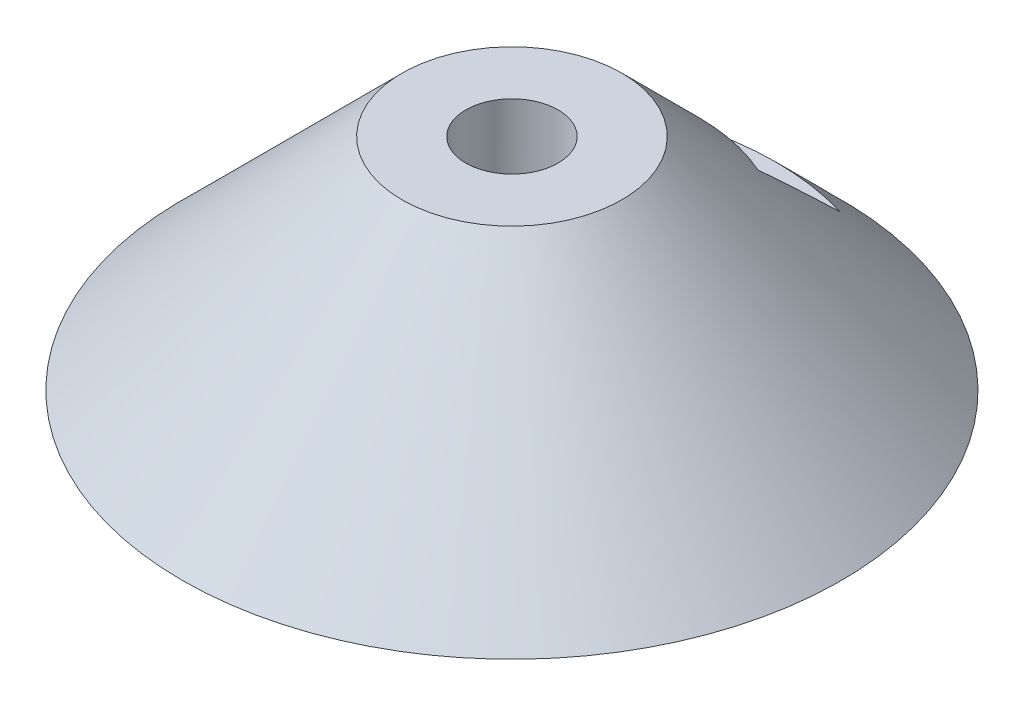
ISO-10303-21;
HEADER;
FILE_DESCRIPTION(('STEP AP214'),'2;1');
FILE_NAME('part.step','',(''),(''),'','','');
FILE_SCHEMA(('AUTOMOTIVE_DESIGN { 1 0 10303 214 1 1 1 1 }'));
ENDSEC;
DATA;
#1=APPLICATION_CONTEXT('core data for automotive mechanical design processes');
#2=APPLICATION_PROTOCOL_DEFINITION('international standard','automotive_design',2000,#1);
#3=PRODUCT_CONTEXT('',#1,'mechanical');
#4=PRODUCT('Part','Part','',(#3));
#5=PRODUCT_RELATED_PRODUCT_CATEGORY('part','',(#4));
#6=PRODUCT_DEFINITION_FORMATION('','',#4);
#7=PRODUCT_DEFINITION_CONTEXT('part definition',#1,'design');
#8=PRODUCT_DEFINITION('design','',#6,#7);
#9=PRODUCT_DEFINITION_SHAPE('','',#8);
#10=(LENGTH_UNIT() NAMED_UNIT(*) SI_UNIT(.MILLI.,.METRE.));
#11=(NAMED_UNIT(*) PLANE_ANGLE_UNIT() SI_UNIT($,.RADIAN.));
#12=(NAMED_UNIT(*) SI_UNIT($,.STERADIAN.) SOLID_ANGLE_UNIT());
#13=UNCERTAINTY_MEASURE_WITH_UNIT(LENGTH_MEASURE(1.E-05),#10,'distance_accuracy_value','');
#14=(GEOMETRIC_REPRESENTATION_CONTEXT(3) GLOBAL_UNCERTAINTY_ASSIGNED_CONTEXT((#13)) GLOBAL_UNIT_ASSIGNED_CONTEXT((#10,
#11,#12)) REPRESENTATION_CONTEXT('',''));
#15=CARTESIAN_POINT('',(0.,0.,0.));
#16=DIRECTION('',(0.,0.,1.));
#17=DIRECTION('',(1.,0.,0.));
#18=AXIS2_PLACEMENT_3D('',#15,#16,#17);
#19=CARTESIAN_POINT('',(0.,10.,0.));
#20=DIRECTION('',(0.,1.,0.));
#21=DIRECTION('',(0.,0.,1.));
#22=AXIS2_PLACEMENT_3D('',#19,#20,#21);
#23=CYLINDRICAL_SURFACE('',#22,4.2);
#24=CARTESIAN_POINT('',(0.,20.,0.));
#25=DIRECTION('',(0.,1.,0.));
#26=DIRECTION('',(0.,0.,1.));
#27=AXIS2_PLACEMENT_3D('',#24,#25,#26);
#28=CIRCLE('',#27,4.2);
#29=CARTESIAN_POINT('',(0.,20.,4.2));
#30=VERTEX_POINT('',#29);
#31=EDGE_CURVE('E213',#30,#30,#28,.T.);
#32=ORIENTED_EDGE('',*,*,#31,.T.);
#33=EDGE_LOOP('',(#32));
#34=FACE_BOUND('',#33,.T.);
#35=CARTESIAN_POINT('',(0.,13.,0.));
#36=DIRECTION('',(0.,1.,0.));
#37=DIRECTION('',(-1.,0.,0.));
#38=AXIS2_PLACEMENT_3D('',#35,#36,#37);
#39=CIRCLE('',#38,4.2);
#40=CARTESIAN_POINT('',(-4.2,13.,0.));
#41=VERTEX_POINT('',#40);
#42=EDGE_CURVE('E180',#41,#41,#39,.F.);
#43=ORIENTED_EDGE('',*,*,#42,.T.);
#44=EDGE_LOOP('',(#43));
#45=FACE_BOUND('',#44,.T.);
#46=ADVANCED_FACE('F33',(#34,#45),#23,.F.);
#47=CARTESIAN_POINT('',(0.,20.,0.));
#48=DIRECTION('',(0.,1.,0.));
#49=DIRECTION('',(0.,0.,1.));
#50=AXIS2_PLACEMENT_3D('',#47,#48,#49);
#51=PLANE('',#50);
#52=ORIENTED_EDGE('',*,*,#31,.F.);
#53=EDGE_LOOP('',(#52));
#54=FACE_BOUND('',#53,.T.);
#55=CARTESIAN_POINT('',(0.,20.,0.));
#56=DIRECTION('',(0.,-1.,0.));
#57=DIRECTION('',(0.,0.,-1.));
#58=AXIS2_PLACEMENT_3D('',#55,#56,#57);
#59=CIRCLE('',#58,10.);
#60=CARTESIAN_POINT('',(0.,20.,-10.));
#61=VERTEX_POINT('',#60);
#62=EDGE_CURVE('E212',#61,#61,#59,.T.);
#63=ORIENTED_EDGE('',*,*,#62,.F.);
#64=EDGE_LOOP('',(#63));
#65=FACE_BOUND('',#64,.T.);
#66=ADVANCED_FACE('F35',(#54,#65),#51,.T.);
#67=CARTESIAN_POINT('',(0.,0.,0.));
#68=DIRECTION('',(0.,-1.,0.));
#69=DIRECTION('',(0.,0.,-1.));
#70=AXIS2_PLACEMENT_3D('',#67,#68,#69);
#71=CONICAL_SURFACE('',#70,30.,0.785398163397448);
#72=CARTESIAN_POINT('',(0.999999999999996,25.2150380177234,-4.67930135509917));
#73=CARTESIAN_POINT('',(0.999999999999996,25.0517172309487,-4.84629975117157));
#74=CARTESIAN_POINT('',(0.999999999999996,24.8882122976122,-5.01311773842072));
#75=CARTESIAN_POINT('',(0.999999999999996,24.5609109565375,-5.34646720047292));
#76=CARTESIAN_POINT('',(0.999999999999996,24.397114549129,-5.51299867559966));
#77=CARTESIAN_POINT('',(0.999999999999996,23.9054038124882,-6.01227431670805));
#78=CARTESIAN_POINT('',(0.999999999999997,23.5771669479885,-6.34470074034811));
#79=CARTESIAN_POINT('',(0.999999999999997,22.9201644927157,-7.00902751143231));
#80=CARTESIAN_POINT('',(0.999999999999997,22.5913989042116,-7.34092786112209));
#81=CARTESIAN_POINT('',(0.999999999999997,21.9335123037873,-8.00437673410787));
#82=CARTESIAN_POINT('',(0.999999999999997,21.6043912915011,-8.33592525704109));
#83=CARTESIAN_POINT('',(0.999999999999997,20.616673858789,-9.33020191409151));
#84=CARTESIAN_POINT('',(0.999999999999997,19.9577146617943,-9.99256959749343));
#85=CARTESIAN_POINT('',(0.999999999999997,18.6392775168894,-11.3167885298493));
#86=CARTESIAN_POINT('',(0.999999999999997,17.9797995688589,-11.9786397786836));
#87=CARTESIAN_POINT('',(0.999999999999998,16.000904746931,-13.963733940631));
#88=CARTESIAN_POINT('',(0.999999999999998,14.6810268924155,-15.2865172719845));
#89=CARTESIAN_POINT('',(0.999999999999998,12.0407384748654,-17.9315636519172));
#90=CARTESIAN_POINT('',(0.999999999999999,10.7203279094961,-19.253826698165));
#91=CARTESIAN_POINT('',(0.999999999999999,8.07921381784963,-21.8980597941546));
#92=CARTESIAN_POINT('',(0.999999999999999,6.75851029161687,-23.2200298439407));
#93=CARTESIAN_POINT('',(1.,4.92586477296996,-25.0541947235452));
#94=CARTESIAN_POINT('',(1.,4.41399568473043,-25.5664624082262));
#95=CARTESIAN_POINT('',(1.,3.39023574502775,-26.5909748048737));
#96=CARTESIAN_POINT('',(1.,2.8783448935914,-27.1032195168669));
#97=CARTESIAN_POINT('',(1.,0.459376789247896,-29.5237740456985));
#98=CARTESIAN_POINT('',(1.,-1.44781733304404,-31.4319670685749));
#99=CARTESIAN_POINT('',(1.,-5.26234784190351,-35.248210928104));
#100=CARTESIAN_POINT('',(1.,-7.16968422847181,-37.156261764756));
#101=CARTESIAN_POINT('',(1.,-10.984456855789,-40.9722846745505));
#102=CARTESIAN_POINT('',(1.,-12.8918930970311,-42.8802567472002));
#103=CARTESIAN_POINT('',(1.,-16.7068273161898,-46.6961391374665));
#104=CARTESIAN_POINT('',(1.,-18.6143252941059,-48.6040494550837));
#105=CARTESIAN_POINT('',(1.,-20.5218403627525,-50.5119426832848));
#106=B_SPLINE_CURVE_WITH_KNOTS('',3,(#72,#73,#74,#75,#76,#77,#78,#79,#80,#81,#82,#83,#84,#85,
#86,#87,#88,#89,#90,#91,#92,#93,#94,#95,#96,#97,#98,#99,#100,#101,#102,#103,#104,#105),
.UNSPECIFIED.,.F.,.F.,(4,2,2,2,2,2,2,2,2,2,2,2,2,2,2,2,4),(0.,0.700755756576796,
1.40151072093304,2.80301627361192,4.20451582753784,5.60601682521214,8.40898309345436,
11.2119500112723,16.8178838350772,22.4238425003767,28.0298003162505,30.2023226526668,
32.3748423866764,40.468501017208,48.562159691145,56.6558630443662,64.7495663254621),.UNSPECIFIED.);
#107=CARTESIAN_POINT('',(1.,2.,-27.9821371592665));
#108=VERTEX_POINT('',#107);
#109=CARTESIAN_POINT('',(1.,0.,-29.9833287011299));
#110=VERTEX_POINT('',#109);
#111=EDGE_CURVE('E133',#108,#110,#106,.T.);
#112=ORIENTED_EDGE('',*,*,#111,.F.);
#113=CARTESIAN_POINT('',(0.,2.,0.));
#114=DIRECTION('',(0.,1.,0.));
#115=DIRECTION('',(-1.,0.,0.));
#116=AXIS2_PLACEMENT_3D('',#113,#114,#115);
#117=CIRCLE('',#116,28.);
#118=CARTESIAN_POINT('',(-1.,2.,-27.9821371592665));
#119=VERTEX_POINT('',#118);
#120=EDGE_CURVE('E11',#119,#108,#117,.F.);
#121=ORIENTED_EDGE('',*,*,#120,.F.);
#122=CARTESIAN_POINT('',(-0.999999999999998,-20.5218403627525,-50.5119426832848));
#123=CARTESIAN_POINT('',(-0.999999999999999,-18.6143295707202,-48.6040537130351));
#124=CARTESIAN_POINT('',(-0.999999999999999,-16.7068358547122,-46.6961476680991));
#125=CARTESIAN_POINT('',(-0.999999999999999,-12.8919106980718,-42.8802743626458));
#126=CARTESIAN_POINT('',(-0.999999999999999,-10.9844792574225,-40.9723071021454));
#127=CARTESIAN_POINT('',(-0.999999999999999,-7.16970717705744,-37.1562847019134));
#128=CARTESIAN_POINT('',(-1.,-5.26236653727402,-35.2482295622495));
#129=CARTESIAN_POINT('',(-1.,-1.44782688723327,-31.4319766966962));
#130=CARTESIAN_POINT('',(-1.,0.459372122986266,-29.5237789707689));
#131=CARTESIAN_POINT('',(-1.,3.31998287424995,-26.6612917702415));
#132=CARTESIAN_POINT('',(-1.,4.27348923922513,-25.7070968588784));
#133=CARTESIAN_POINT('',(-1.,6.18041282983299,-23.798618166586));
#134=CARTESIAN_POINT('',(-1.,7.13383005547493,-22.844334385666));
#135=CARTESIAN_POINT('',(-1.,9.04053619540605,-20.9356401862702));
#136=CARTESIAN_POINT('',(-1.,9.99382510979869,-19.9812297678978));
#137=CARTESIAN_POINT('',(-1.,11.9002090801547,-18.0722146270131));
#138=CARTESIAN_POINT('',(-1.,12.8533041360458,-17.1176099044287));
#139=CARTESIAN_POINT('',(-1.,14.7591866821059,-15.2080880927494));
#140=CARTESIAN_POINT('',(-1.,15.7119741714082,-14.2531710027894));
#141=CARTESIAN_POINT('',(-1.,17.1407325072099,-12.8203748446561));
#142=CARTESIAN_POINT('',(-1.,17.6169145018919,-12.3427063401789));
#143=CARTESIAN_POINT('',(-1.,18.5690776009843,-11.3871687569283));
#144=CARTESIAN_POINT('',(-1.,19.0450587053174,-10.9092996780777));
#145=CARTESIAN_POINT('',(-1.,19.9967288157696,-9.95326656654492));
#146=CARTESIAN_POINT('',(-1.,20.4724178206012,-9.47510253258097));
#147=CARTESIAN_POINT('',(-1.,21.423343479333,-8.51832568190032));
#148=CARTESIAN_POINT('',(-1.,21.8985801337164,-8.03971286566408));
#149=CARTESIAN_POINT('',(-1.,22.6108628548803,-7.32122381438795));
#150=CARTESIAN_POINT('',(-1.,22.8481956552577,-7.08163188221354));
#151=CARTESIAN_POINT('',(-1.,23.322598503967,-6.60218827834783));
#152=CARTESIAN_POINT('',(-1.,23.5596685524492,-6.36233660680526));
#153=CARTESIAN_POINT('',(-1.,24.033452834247,-5.88228004479473));
#154=CARTESIAN_POINT('',(-1.,24.2701670662081,-5.64207515298891));
#155=CARTESIAN_POINT('',(-1.,24.743054565741,-5.16113265344163));
#156=CARTESIAN_POINT('',(-1.,24.9792278322283,-4.92039504463392));
#157=CARTESIAN_POINT('',(-1.,25.2150380177234,-4.67930135509916));
#158=B_SPLINE_CURVE_WITH_KNOTS('',3,(#122,#123,#124,#125,#126,#127,#128,#129,#130,#131,#132,
#133,#134,#135,#136,#137,#138,#139,#140,#141,#142,#143,#144,#145,#146,#147,#148,#149,#150,#151,
#152,#153,#154,#155,#156,#157),.UNSPECIFIED.,.F.,.F.,(4,2,2,2,2,2,2,2,2,2,2,2,2,2,2,2,2,4),(0.,
8.09368517651437,16.1873681380471,24.281044962399,32.3747239387857,36.4215697250926,
40.4684150902235,44.5152571726089,48.5621007616448,52.6089556554918,54.6323805441287,
56.6558062120812,58.6792407364762,60.7026730970467,61.7143944279245,62.7261151797259,
63.7378397734158,64.7495663939689),.UNSPECIFIED.);
#159=CARTESIAN_POINT('',(-1.,0.,-29.9833287011299));
#160=VERTEX_POINT('',#159);
#161=EDGE_CURVE('E110',#160,#119,#158,.T.);
#162=ORIENTED_EDGE('',*,*,#161,.F.);
#163=CARTESIAN_POINT('',(0.,0.,0.));
#164=DIRECTION('',(0.,-1.,0.));
#165=DIRECTION('',(0.,0.,-1.));
#166=AXIS2_PLACEMENT_3D('',#163,#164,#165);
#167=CIRCLE('',#166,30.);
#168=EDGE_CURVE('E207',#110,#160,#167,.T.);
#169=ORIENTED_EDGE('',*,*,#168,.F.);
#170=EDGE_LOOP('',(#112,#121,#162,#169));
#171=FACE_BOUND('',#170,.T.);
#172=CARTESIAN_POINT('',(6.85000000000001,10.287823726375,18.4837061608992));
#173=CARTESIAN_POINT('',(6.85000000000001,10.5592129197154,18.1942719031834));
#174=CARTESIAN_POINT('',(6.85000000000001,10.8302005525982,17.9044604565862));
#175=CARTESIAN_POINT('',(6.85000000000001,11.3712353256481,17.3239577546807));
#176=CARTESIAN_POINT('',(6.85000000000001,11.6412824599144,17.0332664938735));
#177=CARTESIAN_POINT('',(6.85000000000001,12.1803708837145,16.4508008634571));
#178=CARTESIAN_POINT('',(6.85,12.4494118706081,16.1590262135012));
#179=CARTESIAN_POINT('',(6.85,12.9862274642277,15.5743163175319));
#180=CARTESIAN_POINT('',(6.85,13.2540020730851,15.2813810734732));
#181=CARTESIAN_POINT('',(6.85,14.0598435230963,14.395387291069));
#182=CARTESIAN_POINT('',(6.85,14.5956633680994,13.8002747669187));
#183=CARTESIAN_POINT('',(6.85,15.3929709232838,12.9020004647038));
#184=CARTESIAN_POINT('',(6.85,15.6576470196606,12.6016677853495));
#185=CARTESIAN_POINT('',(6.85,16.1844073256703,11.9987367538236));
#186=CARTESIAN_POINT('',(6.85,16.4464915470152,11.6961384119008));
#187=CARTESIAN_POINT('',(6.85,16.9246274368195,11.1382211651575));
#188=CARTESIAN_POINT('',(6.85,17.1411589570244,10.883313750226));
#189=CARTESIAN_POINT('',(6.85,17.5715550462699,10.3712583009672));
#190=CARTESIAN_POINT('',(6.85,17.7854196399821,10.1141102874051));
#191=CARTESIAN_POINT('',(6.85,18.210020828636,9.59702560948227));
#192=CARTESIAN_POINT('',(6.85,18.4207558097211,9.33708761781746));
#193=CARTESIAN_POINT('',(6.85,18.8382423341417,8.81403260714637));
#194=CARTESIAN_POINT('',(6.85,19.0449939441638,8.55091564148029));
#195=CARTESIAN_POINT('',(6.85,19.4531065155555,8.02140115178565));
#196=CARTESIAN_POINT('',(6.85,19.6544778552407,7.75501164793901));
#197=CARTESIAN_POINT('',(6.85,20.0509811911141,7.21757638902787));
#198=CARTESIAN_POINT('',(6.85,20.2461126583663,6.9465302422111));
#199=CARTESIAN_POINT('',(6.85,20.6281566927384,6.39901481390294));
#200=CARTESIAN_POINT('',(6.85,20.8150759194353,6.12255019974796));
#201=CARTESIAN_POINT('',(6.85,21.1783376620013,5.56278909555116));
#202=CARTESIAN_POINT('',(6.85,21.3546826228225,5.27949420619174));
#203=CARTESIAN_POINT('',(6.85,21.658551646515,4.76353878449574));
#204=CARTESIAN_POINT('',(6.85,21.7886697620585,4.53241297638214));
#205=CARTESIAN_POINT('',(6.85,22.0376069428567,4.06405869774873));
#206=CARTESIAN_POINT('',(6.85,22.1564244244078,3.82682937776645));
#207=CARTESIAN_POINT('',(6.85,22.3794140060114,3.346056600015));
#208=CARTESIAN_POINT('',(6.85,22.4836130439851,3.10252576229004));
#209=CARTESIAN_POINT('',(6.85,22.6737264360081,2.60839109659098));
#210=CARTESIAN_POINT('',(6.85,22.7596467632156,2.35778960959304));
#211=CARTESIAN_POINT('',(6.85,22.8921885978546,1.90633409416419));
#212=CARTESIAN_POINT('',(6.85,22.9433002815181,1.70680515788605));
#213=CARTESIAN_POINT('',(6.85,23.0296932361975,1.30432600264772));
#214=CARTESIAN_POINT('',(6.85,23.0649767959726,1.10137628274203));
#215=CARTESIAN_POINT('',(6.85,23.117940138469,0.693556778125896));
#216=CARTESIAN_POINT('',(6.85,23.1356536623992,0.488691439227577));
#217=CARTESIAN_POINT('',(6.85,23.1526231944426,0.0781873442567327));
#218=CARTESIAN_POINT('',(6.85,23.1518794462469,-0.127451401568664));
#219=CARTESIAN_POINT('',(6.85,23.1319793238094,-0.537778059702156));
#220=CARTESIAN_POINT('',(6.85,23.1128268043136,-0.742466162056044));
#221=CARTESIAN_POINT('',(6.85,23.0571575394933,-1.14944637703354));
#222=CARTESIAN_POINT('',(6.85,23.0206394522803,-1.35173830325925));
#223=CARTESIAN_POINT('',(6.85,22.9319061310297,-1.75325378913386));
#224=CARTESIAN_POINT('',(6.85,22.8796577795835,-1.95246993375936));
#225=CARTESIAN_POINT('',(6.85,22.7615944363081,-2.34679022793257));
#226=CARTESIAN_POINT('',(6.85,22.6957793738723,-2.54189435607388));
#227=CARTESIAN_POINT('',(6.85,22.5349556910257,-2.97563885710656));
#228=CARTESIAN_POINT('',(6.85,22.4367541654266,-3.21308880284094));
#229=CARTESIAN_POINT('',(6.85,22.2261225464774,-3.68164475170689));
#230=CARTESIAN_POINT('',(6.85,22.1136853942494,-3.91274753787471));
#231=CARTESIAN_POINT('',(6.85,21.877374071441,-4.36953337678908));
#232=CARTESIAN_POINT('',(6.85,21.753478891349,-4.59520547766643));
#233=CARTESIAN_POINT('',(6.85,21.4967964687286,-5.0413538418556));
#234=CARTESIAN_POINT('',(6.85,21.3640106018125,-5.26183090186651));
#235=CARTESIAN_POINT('',(6.85,21.090159114958,-5.70020186281882));
#236=CARTESIAN_POINT('',(6.85,20.949032094955,-5.91805722612368));
#237=CARTESIAN_POINT('',(6.85,20.6609616742015,-6.34988185000282));
#238=CARTESIAN_POINT('',(6.85,20.5140181064291,-6.56385099872684));
#239=CARTESIAN_POINT('',(6.85,20.2155783621992,-6.98821350480857));
#240=CARTESIAN_POINT('',(6.85,20.0640876092851,-7.1986106873859));
#241=CARTESIAN_POINT('',(6.85,19.7572380589436,-7.61654701717048));
#242=CARTESIAN_POINT('',(6.85,19.6018793974001,-7.82408626438348));
#243=CARTESIAN_POINT('',(6.85,19.2697352417113,-8.26065534203935));
#244=CARTESIAN_POINT('',(6.85,19.0925552058009,-8.48938458460586));
#245=CARTESIAN_POINT('',(6.85,18.7348993275159,-8.94425452117135));
#246=CARTESIAN_POINT('',(6.85,18.5544234049373,-9.17039515195911));
#247=CARTESIAN_POINT('',(6.85,18.0088790580272,-9.84556364502567));
#248=CARTESIAN_POINT('',(6.85,17.6397286423078,-10.2912931193322));
#249=CARTESIAN_POINT('',(6.85,16.8935866537654,-11.1764042331247));
#250=CARTESIAN_POINT('',(6.85,16.5165920418563,-11.6157832961806));
#251=CARTESIAN_POINT('',(6.85,15.7569010539616,-12.4895933886598));
#252=CARTESIAN_POINT('',(6.85,15.3742045490748,-12.9240243058288));
#253=CARTESIAN_POINT('',(6.85,14.6039224505418,-13.78969610836));
#254=CARTESIAN_POINT('',(6.85,14.216330358095,-14.2209311996504));
#255=CARTESIAN_POINT('',(6.85,13.4377888297256,-15.0803657940975));
#256=CARTESIAN_POINT('',(6.85,13.0468393542324,-15.508565261367));
#257=CARTESIAN_POINT('',(6.85,12.2623874177801,-16.36242071819));
#258=CARTESIAN_POINT('',(6.85000000000001,11.868885615768,-16.7880773136848));
#259=CARTESIAN_POINT('',(6.85000000000001,11.0797461127261,-17.637405846188));
#260=CARTESIAN_POINT('',(6.85000000000001,10.6841084079162,-18.0610777796817));
#261=CARTESIAN_POINT('',(6.85000000000001,9.49831052264474,-19.3257035906861));
#262=CARTESIAN_POINT('',(6.85000000000001,8.70558789421593,-20.1642543650887));
#263=CARTESIAN_POINT('',(6.85000000000001,7.11537222020745,-21.8369071091126));
#264=CARTESIAN_POINT('',(6.85000000000001,6.317878891331,-22.6710088088591));
#265=CARTESIAN_POINT('',(6.85000000000001,4.72006618062262,-24.3352973941143));
#266=CARTESIAN_POINT('',(6.85000000000001,3.91974936709643,-25.165486746668));
#267=CARTESIAN_POINT('',(6.85000000000001,2.31657746211807,-26.8233827622911));
#268=CARTESIAN_POINT('',(6.85000000000001,1.51372241282614,-27.6510894661571));
#269=CARTESIAN_POINT('',(6.85000000000001,-0.383419654946413,-29.6023489586463));
#270=CARTESIAN_POINT('',(6.85000000000001,-1.47853477422168,-30.7250963969376));
#271=CARTESIAN_POINT('',(6.85000000000001,-3.67158539833946,-32.9682954005424));
#272=CARTESIAN_POINT('',(6.85000000000001,-4.76952144980312,-34.0887464311174));
#273=CARTESIAN_POINT('',(6.85000000000002,-6.96944114862572,-36.329921233503));
#274=CARTESIAN_POINT('',(6.85000000000002,-8.07142851779619,-37.4506413508342));
#275=CARTESIAN_POINT('',(6.85000000000002,-10.276667449624,-39.6903603436475));
#276=CARTESIAN_POINT('',(6.85000000000002,-11.3799186875978,-40.8093595387742));
#277=CARTESIAN_POINT('',(6.85000000000002,-12.4837061608992,-41.9278283382961));
#278=B_SPLINE_CURVE_WITH_KNOTS('',3,(#172,#173,#174,#175,#176,#177,#178,#179,#180,#181,#182,
#183,#184,#185,#186,#187,#188,#189,#190,#191,#192,#193,#194,#195,#196,#197,#198,#199,#200,#201,
#202,#203,#204,#205,#206,#207,#208,#209,#210,#211,#212,#213,#214,#215,#216,#217,#218,#219,#220,
#221,#222,#223,#224,#225,#226,#227,#228,#229,#230,#231,#232,#233,#234,#235,#236,#237,#238,#239,
#240,#241,#242,#243,#244,#245,#246,#247,#248,#249,#250,#251,#252,#253,#254,#255,#256,#257,#258,
#259,#260,#261,#262,#263,#264,#265,#266,#267,#268,#269,#270,#271,#272,#273,#274,#275,#276,#277),
.UNSPECIFIED.,.F.,.F.,(4,2,2,2,2,2,2,2,2,2,2,2,2,2,2,2,2,2,2,2,2,2,2,2,2,2,2,2,2,2,2,2,2,2,2,2,
2,2,2,2,2,2,2,2,2,2,2,2,2,2,2,2,4),(0.,1.19030213490729,2.38061172473934,3.57125442855147,
4.76189512791404,7.16418880373612,8.36512694995257,9.56605966695567,10.5694258464022,
11.5727827368342,12.5766402221137,13.5804808869319,14.5822202039362,15.5840442116026,
16.5850402179734,17.585803877243,18.3812690209468,19.1768454796805,19.9709360843208,
20.7647667942912,21.3821301495599,21.9994042047992,22.6154905486468,23.2315687583151,
23.8475179910037,24.4635148276425,25.0808177196342,25.6981238243985,26.4683794606092,
27.239018542703,28.0110998019907,28.7830618757816,29.5616647588082,30.3402900156278,
31.1180208547907,31.8957244098482,32.763666292802,33.6316293249819,35.3677255810444,
37.1045074630669,38.8413286678066,40.5807672929698,42.3202264476623,44.059253101063,
45.7982828331246,49.2600706455191,52.7220661100523,56.1814649264705,59.6408065808366,
64.3459623813541,69.0521115192688,73.7673520009986,78.4815734395252),.UNSPECIFIED.);
#279=CARTESIAN_POINT('',(6.85,13.,-15.5588399310488));
#280=VERTEX_POINT('',#279);
#281=CARTESIAN_POINT('',(6.85,6.,-23.0016847209068));
#282=VERTEX_POINT('',#281);
#283=EDGE_CURVE('E183',#280,#282,#278,.T.);
#284=ORIENTED_EDGE('',*,*,#283,.F.);
#285=CARTESIAN_POINT('',(0.,13.,0.));
#286=DIRECTION('',(0.,1.,0.));
#287=DIRECTION('',(-1.,0.,0.));
#288=AXIS2_PLACEMENT_3D('',#285,#286,#287);
#289=CIRCLE('',#288,17.);
#290=CARTESIAN_POINT('',(-6.84999999999999,13.,-15.5588399310488));
#291=VERTEX_POINT('',#290);
#292=EDGE_CURVE('E217',#291,#280,#289,.F.);
#293=ORIENTED_EDGE('',*,*,#292,.F.);
#294=CARTESIAN_POINT('',(-6.84999999999999,-12.4837061608992,-41.9278283382961));
#295=CARTESIAN_POINT('',(-6.84999999999999,-11.8926040321935,-41.3288872316615));
#296=CARTESIAN_POINT('',(-6.84999999999999,-11.3016664011921,-40.7297837610334));
#297=CARTESIAN_POINT('',(-6.84999999999999,-10.1201708320421,-39.5312003996122));
#298=CARTESIAN_POINT('',(-6.84999999999999,-9.5296128945868,-38.9317205081357));
#299=CARTESIAN_POINT('',(-6.84999999999999,-7.75770249605457,-37.13174251026));
#300=CARTESIAN_POINT('',(-6.84999999999999,-6.57700014738695,-35.9306042279407));
#301=CARTESIAN_POINT('',(-6.84999999999999,-4.20161735719555,-33.5094613888343));
#302=CARTESIAN_POINT('',(-6.84999999999999,-3.00696900820421,-32.2894253276144));
#303=CARTESIAN_POINT('',(-6.84999999999999,-1.2179184344922,-30.4573975201158));
#304=CARTESIAN_POINT('',(-6.84999999999999,-0.622274520987005,-29.8466184055239));
#305=CARTESIAN_POINT('',(-6.84999999999999,0.568006842931138,-28.6241013296329));
#306=CARTESIAN_POINT('',(-6.84999999999999,1.16264431101379,-28.0123633855384));
#307=CARTESIAN_POINT('',(-6.84999999999999,2.61696209838781,-26.5132929987044));
#308=CARTESIAN_POINT('',(-6.84999999999999,3.47598581481331,-25.6253230400909));
#309=CARTESIAN_POINT('',(-6.84999999999999,5.19072051464846,-23.8460529168296));
#310=CARTESIAN_POINT('',(-6.84999999999999,6.04643122982154,-22.9547524935557));
#311=CARTESIAN_POINT('',(-6.84999999999999,7.75543180893577,-21.165286737634));
#312=CARTESIAN_POINT('',(-6.84999999999999,8.60870918059131,-20.2671094513745));
#313=CARTESIAN_POINT('',(-6.84999999999999,9.88331997006185,-18.9150902378622));
#314=CARTESIAN_POINT('',(-6.84999999999999,10.3072443723921,-18.4636913583581));
#315=CARTESIAN_POINT('',(-6.84999999999999,11.1529500377589,-17.5588934309455));
#316=CARTESIAN_POINT('',(-6.84999999999999,11.5747313121478,-17.1054943936558));
#317=CARTESIAN_POINT('',(-6.84999999999999,12.410948072776,-16.2012810878219));
#318=CARTESIAN_POINT('',(-6.84999999999999,12.8254130867353,-15.7504941500347));
#319=CARTESIAN_POINT('',(-6.84999999999999,13.6510386614556,-14.8458828804752));
#320=CARTESIAN_POINT('',(-6.84999999999999,14.0621991495933,-14.3920584823484));
#321=CARTESIAN_POINT('',(-6.84999999999999,14.8807124529219,-13.4800196593092));
#322=CARTESIAN_POINT('',(-6.84999999999999,15.2880602340691,-13.0218007079906));
#323=CARTESIAN_POINT('',(-6.84999999999999,16.0970186307289,-12.1003749855122));
#324=CARTESIAN_POINT('',(-6.84999999999999,16.4986296470741,-11.6371685668364));
#325=CARTESIAN_POINT('',(-6.84999999999999,17.2920521125181,-10.7064739588161));
#326=CARTESIAN_POINT('',(-6.84999999999999,17.6839030943413,-10.2390196558183));
#327=CARTESIAN_POINT('',(-6.84999999999999,18.2635265555637,-9.53102903075112));
#328=CARTESIAN_POINT('',(-6.84999999999999,18.4554073105431,-9.29385659587184));
#329=CARTESIAN_POINT('',(-6.84999999999999,18.8358337010082,-8.81685114276829));
#330=CARTESIAN_POINT('',(-6.84999999999999,19.0243793780523,-8.57701815775776));
#331=CARTESIAN_POINT('',(-6.84999999999999,19.3970224477696,-8.0946913905264));
#332=CARTESIAN_POINT('',(-6.84999999999999,19.5811280907747,-7.85220399537983));
#333=CARTESIAN_POINT('',(-6.84999999999999,19.9443315499274,-7.36347222776094));
#334=CARTESIAN_POINT('',(-6.84999999999999,20.1234290640496,-7.11722763008117));
#335=CARTESIAN_POINT('',(-6.84999999999999,20.475210619627,-6.62041343820574));
#336=CARTESIAN_POINT('',(-6.84999999999999,20.6478985107893,-6.36984657697018));
#337=CARTESIAN_POINT('',(-6.84999999999999,20.9852362730709,-5.86337613254883));
#338=CARTESIAN_POINT('',(-6.84999999999999,21.1498875797009,-5.60747351418743));
#339=CARTESIAN_POINT('',(-6.84999999999999,21.3469178658083,-5.28730864589691));
#340=CARTESIAN_POINT('',(-6.84999999999999,21.3842132186315,-5.2260582592404));
#341=CARTESIAN_POINT('',(-6.84999999999999,21.4581882094438,-5.10318124608054));
#342=CARTESIAN_POINT('',(-6.84999999999999,21.4948678077805,-5.041554595693));
#343=CARTESIAN_POINT('',(-6.84999999999999,21.6039301154481,-4.85607823593794));
#344=CARTESIAN_POINT('',(-6.84999999999999,21.6753274984824,-4.73164644363154));
#345=CARTESIAN_POINT('',(-6.84999999999999,21.8151390792748,-4.48109982554373));
#346=CARTESIAN_POINT('',(-6.84999999999999,21.88355299391,-4.35498484150888));
#347=CARTESIAN_POINT('',(-6.84999999999999,22.0169727121639,-4.10096410307476));
#348=CARTESIAN_POINT('',(-6.84999999999999,22.0819785776185,-3.97305838122026));
#349=CARTESIAN_POINT('',(-6.84999999999999,22.2076017986554,-3.71636848878141));
#350=CARTESIAN_POINT('',(-6.84999999999999,22.2682501320832,-3.58759955809813));
#351=CARTESIAN_POINT('',(-6.84999999999999,22.3851877465883,-3.3281049572967));
#352=CARTESIAN_POINT('',(-6.84999999999999,22.4414769607873,-3.1973792571943));
#353=CARTESIAN_POINT('',(-6.84999999999999,22.6029173681338,-2.80216986344419));
#354=CARTESIAN_POINT('',(-6.84999999999999,22.7006852499964,-2.53456585736157));
#355=CARTESIAN_POINT('',(-6.84999999999999,22.8481163584603,-2.06456190843136));
#356=CARTESIAN_POINT('',(-6.84999999999999,22.9036442876507,-1.86400132414283));
#357=CARTESIAN_POINT('',(-6.84999999999999,22.9990656798478,-1.45918785008965));
#358=CARTESIAN_POINT('',(-6.84999999999999,23.0389632135824,-1.25493593619857));
#359=CARTESIAN_POINT('',(-6.84999999999999,23.1011150216725,-0.844452552413957));
#360=CARTESIAN_POINT('',(-6.84999999999999,23.1234299537385,-0.638230394530759));
#361=CARTESIAN_POINT('',(-6.84999999999999,23.1494268041199,-0.224591481688424));
#362=CARTESIAN_POINT('',(-6.84999999999999,23.1531084453164,-0.0171747090086116));
#363=CARTESIAN_POINT('',(-6.84999999999999,23.1416175896273,0.397351672930833));
#364=CARTESIAN_POINT('',(-6.84999999999999,23.1264246959085,0.604460707318611));
#365=CARTESIAN_POINT('',(-6.84999999999999,23.0780093344984,1.0165391155169));
#366=CARTESIAN_POINT('',(-6.84999999999999,23.0447857494436,1.22150835592178));
#367=CARTESIAN_POINT('',(-6.84999999999999,22.9618340891544,1.62887569159683));
#368=CARTESIAN_POINT('',(-6.84999999999999,22.9120413866365,1.83126044495636));
#369=CARTESIAN_POINT('',(-6.84999999999999,22.798125147427,2.23190832985212));
#370=CARTESIAN_POINT('',(-6.84999999999999,22.7340011817835,2.43017133782539));
#371=CARTESIAN_POINT('',(-6.84999999999999,22.5814668989592,2.85627276676205));
#372=CARTESIAN_POINT('',(-6.84999999999999,22.4907739093088,3.08328831909108));
#373=CARTESIAN_POINT('',(-6.84999999999999,22.2958951407249,3.53150106691888));
#374=CARTESIAN_POINT('',(-6.84999999999999,22.1917032083329,3.75269555323278));
#375=CARTESIAN_POINT('',(-6.84999999999999,21.9723607461595,4.19002882481023));
#376=CARTESIAN_POINT('',(-6.84999999999999,21.8571912388973,4.40615801965464));
#377=CARTESIAN_POINT('',(-6.84999999999999,21.6182291462571,4.83352441275904));
#378=CARTESIAN_POINT('',(-6.84999999999999,21.4944377641233,5.04476228817668));
#379=CARTESIAN_POINT('',(-6.84999999999999,21.2383476103616,5.46555192795297));
#380=CARTESIAN_POINT('',(-6.84999999999999,21.1059631845526,5.67505131963391));
#381=CARTESIAN_POINT('',(-6.84999999999999,20.8354316592066,6.09028846255042));
#382=CARTESIAN_POINT('',(-6.84999999999999,20.6972844141071,6.29602611857957));
#383=CARTESIAN_POINT('',(-6.84999999999999,20.4164317905886,6.70403986710384));
#384=CARTESIAN_POINT('',(-6.84999999999999,20.2737313294068,6.90631935421831));
#385=CARTESIAN_POINT('',(-6.84999999999999,19.9844574860477,7.308078587576));
#386=CARTESIAN_POINT('',(-6.84999999999999,19.8378841563649,7.50755837171139));
#387=CARTESIAN_POINT('',(-6.84999999999999,19.5056136205114,7.95213475001675));
#388=CARTESIAN_POINT('',(-6.84999999999999,19.3190402047275,8.1965757177152));
#389=CARTESIAN_POINT('',(-6.84999999999999,18.94187378921,8.68234191284135));
#390=CARTESIAN_POINT('',(-6.84999999999999,18.7512806462211,8.92366702873024));
#391=CARTESIAN_POINT('',(-6.84999999999999,18.366786409675,9.40371290566354));
#392=CARTESIAN_POINT('',(-6.84999999999999,18.1728849075182,9.6424333389588));
#393=CARTESIAN_POINT('',(-6.84999999999999,17.7823571797875,10.1176370829607));
#394=CARTESIAN_POINT('',(-6.84999999999999,17.5857309145129,10.3541203609865));
#395=CARTESIAN_POINT('',(-6.84999999999999,16.9920621232863,11.0611851554115));
#396=CARTESIAN_POINT('',(-6.84999999999999,16.5916132165265,11.5289064726244));
#397=CARTESIAN_POINT('',(-6.84999999999999,15.7842091444658,12.4586984565992));
#398=CARTESIAN_POINT('',(-6.84999999999999,15.3772537985837,12.920768965897));
#399=CARTESIAN_POINT('',(-6.84999999999999,14.7758368005838,13.5964053945957));
#400=CARTESIAN_POINT('',(-6.84999999999999,14.5832687761653,13.8116609658099));
#401=CARTESIAN_POINT('',(-6.84999999999999,14.1971905429766,14.2413196302623));
#402=CARTESIAN_POINT('',(-6.84999999999999,14.0036803486482,14.4557227364763));
#403=CARTESIAN_POINT('',(-6.84999999999999,13.4218920967708,15.0978147362414));
#404=CARTESIAN_POINT('',(-6.84999999999999,13.0323672245599,15.5243741430299));
#405=CARTESIAN_POINT('',(-6.84999999999999,12.251526510296,16.3741843533518));
#406=CARTESIAN_POINT('',(-6.84999999999999,11.8602161989934,16.7974402466671));
#407=CARTESIAN_POINT('',(-6.84999999999999,11.0754862074226,17.6419580663854));
#408=CARTESIAN_POINT('',(-6.84999999999999,10.6820666208386,18.0632200798078));
#409=CARTESIAN_POINT('',(-6.84999999999999,10.287823726375,18.4837061608992));
#410=B_SPLINE_CURVE_WITH_KNOTS('',3,(#294,#295,#296,#297,#298,#299,#300,#301,#302,#303,#304,
#305,#306,#307,#308,#309,#310,#311,#312,#313,#314,#315,#316,#317,#318,#319,#320,#321,#322,#323,
#324,#325,#326,#327,#328,#329,#330,#331,#332,#333,#334,#335,#336,#337,#338,#339,#340,#341,#342,
#343,#344,#345,#346,#347,#348,#349,#350,#351,#352,#353,#354,#355,#356,#357,#358,#359,#360,#361,
#362,#363,#364,#365,#366,#367,#368,#369,#370,#371,#372,#373,#374,#375,#376,#377,#378,#379,#380,
#381,#382,#383,#384,#385,#386,#387,#388,#389,#390,#391,#392,#393,#394,#395,#396,#397,#398,#399,
#400,#401,#402,#403,#404,#405,#406,#407,#408,#409),.UNSPECIFIED.,.F.,.F.,(4,2,2,2,2,2,2,2,2,2,2,
2,2,2,2,2,2,2,2,2,2,2,2,2,2,2,2,2,2,2,2,2,2,2,2,2,2,2,2,2,2,2,2,2,2,2,2,2,2,2,2,2,2,2,2,2,2,4),
(0.,2.52451766358494,5.04903992325721,10.1018707475725,15.2244678885466,17.7838780362576,
20.3432427735423,24.0496776112634,27.7564065142301,31.4729943351017,33.3307445955848,
35.1884850051906,37.0255652111635,38.8626856807453,40.7019618301419,42.5411088328909,
44.3708759169462,45.2860691524813,46.2012509757672,47.1145756527585,48.0279552913675,
48.9407771593014,49.8534353759682,50.068567518936,50.2837134628938,50.7140558401403,
51.144438967201,51.5748142826285,52.0017427206544,52.428677707364,53.2822531867798,
53.9060527054256,54.5296896556355,55.1511656019848,55.7726507910496,56.3948081748865,
57.0170041182748,57.6416559320501,58.266326444908,58.9991545575235,59.7323179111335,
60.4667725386499,61.2011248723827,61.9444750484134,62.6878440120517,63.4304356754469,
64.1730172786359,65.0954865846225,66.0179888213925,66.9406058288061,67.8632362931958,
69.7103289286368,71.5574729179827,72.4239327710877,73.2903793845812,75.0233215267984,
76.7525982862995,78.4817988653702),.UNSPECIFIED.);
#411=CARTESIAN_POINT('',(-6.84999999999999,6.,-23.0016847209069));
#412=VERTEX_POINT('',#411);
#413=EDGE_CURVE('E172',#412,#291,#410,.T.);
#414=ORIENTED_EDGE('',*,*,#413,.F.);
#415=CARTESIAN_POINT('',(0.,6.,0.));
#416=DIRECTION('',(0.,-1.,0.));
#417=DIRECTION('',(1.,0.,0.));
#418=AXIS2_PLACEMENT_3D('',#415,#416,#417);
#419=CIRCLE('',#418,24.);
#420=EDGE_CURVE('E179',#282,#412,#419,.F.);
#421=ORIENTED_EDGE('',*,*,#420,.F.);
#422=EDGE_LOOP('',(#284,#293,#414,#421));
#423=FACE_BOUND('',#422,.T.);
#424=ORIENTED_EDGE('',*,*,#62,.T.);
#425=EDGE_LOOP('',(#424));
#426=FACE_BOUND('',#425,.T.);
#427=ADVANCED_FACE('F140',(#171,#423,#426),#71,.T.);
#428=CARTESIAN_POINT('',(30.,0.,0.));
#429=DIRECTION('',(0.,-1.,0.));
#430=DIRECTION('',(0.,0.,-1.));
#431=AXIS2_PLACEMENT_3D('',#428,#429,#430);
#432=PLANE('',#431);
#433=DIRECTION('',(0.,0.,1.));
#434=VECTOR('',#433,1.);
#435=CARTESIAN_POINT('',(1.,0.,0.));
#436=LINE('',#435,#434);
#437=CARTESIAN_POINT('',(1.,0.,0.));
#438=VERTEX_POINT('',#437);
#439=EDGE_CURVE('E41',#110,#438,#436,.T.);
#440=ORIENTED_EDGE('',*,*,#439,.F.);
#441=ORIENTED_EDGE('',*,*,#168,.T.);
#442=DIRECTION('',(0.,0.,-1.));
#443=VECTOR('',#442,1.);
#444=CARTESIAN_POINT('',(-1.,0.,0.));
#445=LINE('',#444,#443);
#446=CARTESIAN_POINT('',(-1.,0.,0.));
#447=VERTEX_POINT('',#446);
#448=EDGE_CURVE('E209',#447,#160,#445,.T.);
#449=ORIENTED_EDGE('',*,*,#448,.F.);
#450=DIRECTION('',(-1.,0.,0.));
#451=VECTOR('',#450,1.);
#452=CARTESIAN_POINT('',(30.,0.,0.));
#453=LINE('',#452,#451);
#454=EDGE_CURVE('E119',#438,#447,#453,.T.);
#455=ORIENTED_EDGE('',*,*,#454,.F.);
#456=EDGE_LOOP('',(#440,#441,#449,#455));
#457=FACE_BOUND('',#456,.T.);
#458=ADVANCED_FACE('F196',(#457),#432,.T.);
#459=CARTESIAN_POINT('',(6.85,13.,-59.));
#460=DIRECTION('',(0.,1.,0.));
#461=DIRECTION('',(-1.,0.,0.));
#462=AXIS2_PLACEMENT_3D('',#459,#460,#461);
#463=PLANE('',#462);
#464=DIRECTION('',(0.,0.,1.));
#465=VECTOR('',#464,1.);
#466=CARTESIAN_POINT('',(6.85,13.,-59.));
#467=LINE('',#466,#465);
#468=CARTESIAN_POINT('',(6.85000000000001,13.,3.95484934394894));
#469=VERTEX_POINT('',#468);
#470=EDGE_CURVE('E222',#280,#469,#467,.T.);
#471=ORIENTED_EDGE('',*,*,#470,.T.);
#472=DIRECTION('',(0.866025403784439,0.,-0.5));
#473=VECTOR('',#472,1.);
#474=CARTESIAN_POINT('',(0.,13.,7.90969868789787));
#475=LINE('',#474,#473);
#476=CARTESIAN_POINT('',(0.,13.,7.90969868789787));
#477=VERTEX_POINT('',#476);
#478=EDGE_CURVE('E240',#477,#469,#475,.T.);
#479=ORIENTED_EDGE('',*,*,#478,.F.);
#480=DIRECTION('',(0.866025403784438,0.,0.5));
#481=VECTOR('',#480,1.);
#482=CARTESIAN_POINT('',(-6.84999999999999,13.,3.95484934394894));
#483=LINE('',#482,#481);
#484=CARTESIAN_POINT('',(-6.84999999999999,13.,3.95484934394894));
#485=VERTEX_POINT('',#484);
#486=EDGE_CURVE('E237',#485,#477,#483,.T.);
#487=ORIENTED_EDGE('',*,*,#486,.F.);
#488=DIRECTION('',(0.,0.,1.));
#489=VECTOR('',#488,1.);
#490=CARTESIAN_POINT('',(-6.84999999999999,13.,-59.));
#491=LINE('',#490,#489);
#492=EDGE_CURVE('E56',#291,#485,#491,.T.);
#493=ORIENTED_EDGE('',*,*,#492,.F.);
#494=ORIENTED_EDGE('',*,*,#292,.T.);
#495=EDGE_LOOP('',(#471,#479,#487,#493,#494));
#496=FACE_BOUND('',#495,.T.);
#497=ORIENTED_EDGE('',*,*,#42,.F.);
#498=EDGE_LOOP('',(#497));
#499=FACE_BOUND('',#498,.T.);
#500=ADVANCED_FACE('F169',(#496,#499),#463,.F.);
#501=CARTESIAN_POINT('',(6.85,13.,-59.));
#502=DIRECTION('',(1.,0.,0.));
#503=DIRECTION('',(0.,1.,0.));
#504=AXIS2_PLACEMENT_3D('',#501,#502,#503);
#505=PLANE('',#504);
#506=DIRECTION('',(0.,-1.,0.));
#507=VECTOR('',#506,1.);
#508=CARTESIAN_POINT('',(6.85000000000001,13.,3.95484934394894));
#509=LINE('',#508,#507);
#510=CARTESIAN_POINT('',(6.85000000000001,6.,3.95484934394894));
#511=VERTEX_POINT('',#510);
#512=EDGE_CURVE('E224',#469,#511,#509,.T.);
#513=ORIENTED_EDGE('',*,*,#512,.F.);
#514=ORIENTED_EDGE('',*,*,#470,.F.);
#515=ORIENTED_EDGE('',*,*,#283,.T.);
#516=DIRECTION('',(0.,0.,1.));
#517=VECTOR('',#516,1.);
#518=CARTESIAN_POINT('',(6.85000000000001,6.,-59.));
#519=LINE('',#518,#517);
#520=EDGE_CURVE('E221',#282,#511,#519,.T.);
#521=ORIENTED_EDGE('',*,*,#520,.T.);
#522=EDGE_LOOP('',(#513,#514,#515,#521));
#523=FACE_BOUND('',#522,.T.);
#524=ADVANCED_FACE('F163',(#523),#505,.F.);
#525=CARTESIAN_POINT('',(6.85000000000001,6.,-59.));
#526=DIRECTION('',(0.,-1.,0.));
#527=DIRECTION('',(1.,0.,0.));
#528=AXIS2_PLACEMENT_3D('',#525,#526,#527);
#529=PLANE('',#528);
#530=DIRECTION('',(0.866025403784439,0.,-0.5));
#531=VECTOR('',#530,1.);
#532=CARTESIAN_POINT('',(0.,6.,7.90969868789787));
#533=LINE('',#532,#531);
#534=CARTESIAN_POINT('',(0.,6.,7.90969868789787));
#535=VERTEX_POINT('',#534);
#536=EDGE_CURVE('E241',#535,#511,#533,.T.);
#537=ORIENTED_EDGE('',*,*,#536,.T.);
#538=ORIENTED_EDGE('',*,*,#520,.F.);
#539=ORIENTED_EDGE('',*,*,#420,.T.);
#540=DIRECTION('',(0.,0.,1.));
#541=VECTOR('',#540,1.);
#542=CARTESIAN_POINT('',(-6.84999999999999,6.,-59.));
#543=LINE('',#542,#541);
#544=CARTESIAN_POINT('',(-6.84999999999999,6.,3.95484934394894));
#545=VERTEX_POINT('',#544);
#546=EDGE_CURVE('E226',#412,#545,#543,.T.);
#547=ORIENTED_EDGE('',*,*,#546,.T.);
#548=DIRECTION('',(0.866025403784438,0.,0.5));
#549=VECTOR('',#548,1.);
#550=CARTESIAN_POINT('',(-6.84999999999999,6.,3.95484934394894));
#551=LINE('',#550,#549);
#552=EDGE_CURVE('E238',#545,#535,#551,.T.);
#553=ORIENTED_EDGE('',*,*,#552,.T.);
#554=EDGE_LOOP('',(#537,#538,#539,#547,#553));
#555=FACE_BOUND('',#554,.T.);
#556=ADVANCED_FACE('F160',(#555),#529,.F.);
#557=CARTESIAN_POINT('',(-6.84999999999999,13.,-59.));
#558=DIRECTION('',(-1.,0.,0.));
#559=DIRECTION('',(0.,-1.,0.));
#560=AXIS2_PLACEMENT_3D('',#557,#558,#559);
#561=PLANE('',#560);
#562=DIRECTION('',(0.,-1.,0.));
#563=VECTOR('',#562,1.);
#564=CARTESIAN_POINT('',(-6.84999999999999,13.,3.95484934394894));
#565=LINE('',#564,#563);
#566=EDGE_CURVE('E231',#485,#545,#565,.T.);
#567=ORIENTED_EDGE('',*,*,#566,.T.);
#568=ORIENTED_EDGE('',*,*,#546,.F.);
#569=ORIENTED_EDGE('',*,*,#413,.T.);
#570=ORIENTED_EDGE('',*,*,#492,.T.);
#571=EDGE_LOOP('',(#567,#568,#569,#570));
#572=FACE_BOUND('',#571,.T.);
#573=ADVANCED_FACE('F158',(#572),#561,.F.);
#574=CARTESIAN_POINT('',(0.,13.,7.90969868789787));
#575=DIRECTION('',(-0.5,0.,-0.866025403784439));
#576=DIRECTION('',(-0.866025403784439,0.,0.5));
#577=AXIS2_PLACEMENT_3D('',#574,#575,#576);
#578=PLANE('',#577);
#579=ORIENTED_EDGE('',*,*,#536,.F.);
#580=DIRECTION('',(0.,-1.,0.));
#581=VECTOR('',#580,1.);
#582=CARTESIAN_POINT('',(0.,13.,7.90969868789787));
#583=LINE('',#582,#581);
#584=EDGE_CURVE('E234',#477,#535,#583,.T.);
#585=ORIENTED_EDGE('',*,*,#584,.F.);
#586=ORIENTED_EDGE('',*,*,#478,.T.);
#587=ORIENTED_EDGE('',*,*,#512,.T.);
#588=EDGE_LOOP('',(#579,#585,#586,#587));
#589=FACE_BOUND('',#588,.T.);
#590=ADVANCED_FACE('F154',(#589),#578,.T.);
#591=CARTESIAN_POINT('',(-6.84999999999999,13.,3.95484934394894));
#592=DIRECTION('',(0.5,0.,-0.866025403784438));
#593=DIRECTION('',(-0.866025403784439,0.,-0.5));
#594=AXIS2_PLACEMENT_3D('',#591,#592,#593);
#595=PLANE('',#594);
#596=ORIENTED_EDGE('',*,*,#552,.F.);
#597=ORIENTED_EDGE('',*,*,#566,.F.);
#598=ORIENTED_EDGE('',*,*,#486,.T.);
#599=ORIENTED_EDGE('',*,*,#584,.T.);
#600=EDGE_LOOP('',(#596,#597,#598,#599));
#601=FACE_BOUND('',#600,.T.);
#602=ADVANCED_FACE('F151',(#601),#595,.T.);
#603=CARTESIAN_POINT('',(-1.,2.,-61.));
#604=DIRECTION('',(0.,1.,0.));
#605=DIRECTION('',(-1.,0.,0.));
#606=AXIS2_PLACEMENT_3D('',#603,#604,#605);
#607=PLANE('',#606);
#608=ORIENTED_EDGE('',*,*,#120,.T.);
#609=DIRECTION('',(0.,0.,1.));
#610=VECTOR('',#609,1.);
#611=CARTESIAN_POINT('',(1.,2.,-61.));
#612=LINE('',#611,#610);
#613=CARTESIAN_POINT('',(1.,2.,0.));
#614=VERTEX_POINT('',#613);
#615=EDGE_CURVE('E114',#108,#614,#612,.T.);
#616=ORIENTED_EDGE('',*,*,#615,.T.);
#617=DIRECTION('',(-1.,0.,0.));
#618=VECTOR('',#617,1.);
#619=CARTESIAN_POINT('',(-1.,2.,0.));
#620=LINE('',#619,#618);
#621=CARTESIAN_POINT('',(-1.,2.,0.));
#622=VERTEX_POINT('',#621);
#623=EDGE_CURVE('E117',#614,#622,#620,.T.);
#624=ORIENTED_EDGE('',*,*,#623,.T.);
#625=DIRECTION('',(0.,0.,1.));
#626=VECTOR('',#625,1.);
#627=CARTESIAN_POINT('',(-1.,2.,-61.));
#628=LINE('',#627,#626);
#629=EDGE_CURVE('E104',#119,#622,#628,.T.);
#630=ORIENTED_EDGE('',*,*,#629,.F.);
#631=EDGE_LOOP('',(#608,#616,#624,#630));
#632=FACE_BOUND('',#631,.T.);
#633=ADVANCED_FACE('F121',(#632),#607,.F.);
#634=CARTESIAN_POINT('',(1.,-2.,-61.));
#635=DIRECTION('',(1.,0.,0.));
#636=DIRECTION('',(0.,1.,0.));
#637=AXIS2_PLACEMENT_3D('',#634,#635,#636);
#638=PLANE('',#637);
#639=ORIENTED_EDGE('',*,*,#111,.T.);
#640=ORIENTED_EDGE('',*,*,#439,.T.);
#641=DIRECTION('',(0.,1.,0.));
#642=VECTOR('',#641,1.);
#643=CARTESIAN_POINT('',(1.,-2.,0.));
#644=LINE('',#643,#642);
#645=EDGE_CURVE('E48',#438,#614,#644,.T.);
#646=ORIENTED_EDGE('',*,*,#645,.T.);
#647=ORIENTED_EDGE('',*,*,#615,.F.);
#648=EDGE_LOOP('',(#639,#640,#646,#647));
#649=FACE_BOUND('',#648,.T.);
#650=ADVANCED_FACE('F146',(#649),#638,.F.);
#651=CARTESIAN_POINT('',(-1.,-2.,-61.));
#652=DIRECTION('',(-1.,0.,0.));
#653=DIRECTION('',(0.,-1.,0.));
#654=AXIS2_PLACEMENT_3D('',#651,#652,#653);
#655=PLANE('',#654);
#656=ORIENTED_EDGE('',*,*,#161,.T.);
#657=ORIENTED_EDGE('',*,*,#629,.T.);
#658=DIRECTION('',(0.,-1.,0.));
#659=VECTOR('',#658,1.);
#660=CARTESIAN_POINT('',(-1.,-2.,0.));
#661=LINE('',#660,#659);
#662=EDGE_CURVE('E107',#622,#447,#661,.T.);
#663=ORIENTED_EDGE('',*,*,#662,.T.);
#664=ORIENTED_EDGE('',*,*,#448,.T.);
#665=EDGE_LOOP('',(#656,#657,#663,#664));
#666=FACE_BOUND('',#665,.T.);
#667=ADVANCED_FACE('F106',(#666),#655,.F.);
#668=CARTESIAN_POINT('',(0.,0.,0.));
#669=DIRECTION('',(0.,0.,1.));
#670=DIRECTION('',(1.,0.,0.));
#671=AXIS2_PLACEMENT_3D('',#668,#669,#670);
#672=PLANE('',#671);
#673=ORIENTED_EDGE('',*,*,#454,.T.);
#674=ORIENTED_EDGE('',*,*,#662,.F.);
#675=ORIENTED_EDGE('',*,*,#623,.F.);
#676=ORIENTED_EDGE('',*,*,#645,.F.);
#677=EDGE_LOOP('',(#673,#674,#675,#676));
#678=FACE_BOUND('',#677,.T.);
#679=ADVANCED_FACE('F116',(#678),#672,.F.);
#680=CLOSED_SHELL('',(#46,#66,#427,#458,#500,#524,#556,#573,#590,#602,#633,#650,#667,#679));
#681=MANIFOLD_SOLID_BREP('B2',#680);
#682=ADVANCED_BREP_SHAPE_REPRESENTATION('',(#18,#681),#14);
#683=SHAPE_DEFINITION_REPRESENTATION(#9,#682);
ENDSEC;
END-ISO-10303-21;
